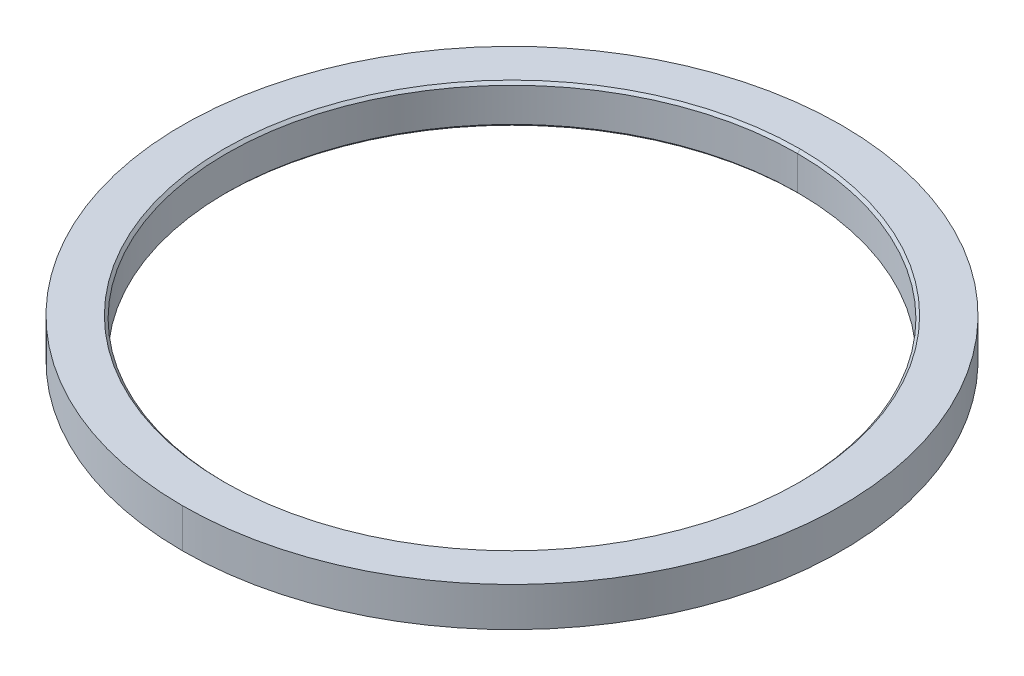
ISO-10303-21;
HEADER;
FILE_DESCRIPTION(('STEP AP214'),'2;1');
FILE_NAME('part.step','',(''),(''),'','','');
FILE_SCHEMA(('AUTOMOTIVE_DESIGN { 1 0 10303 214 1 1 1 1 }'));
ENDSEC;
DATA;
#1=APPLICATION_CONTEXT('core data for automotive mechanical design processes');
#2=APPLICATION_PROTOCOL_DEFINITION('international standard','automotive_design',2000,#1);
#3=PRODUCT_CONTEXT('',#1,'mechanical');
#4=PRODUCT('Part','Part','',(#3));
#5=PRODUCT_RELATED_PRODUCT_CATEGORY('part','',(#4));
#6=PRODUCT_DEFINITION_FORMATION('','',#4);
#7=PRODUCT_DEFINITION_CONTEXT('part definition',#1,'design');
#8=PRODUCT_DEFINITION('design','',#6,#7);
#9=PRODUCT_DEFINITION_SHAPE('','',#8);
#10=(LENGTH_UNIT() NAMED_UNIT(*) SI_UNIT(.MILLI.,.METRE.));
#11=(NAMED_UNIT(*) PLANE_ANGLE_UNIT() SI_UNIT($,.RADIAN.));
#12=(NAMED_UNIT(*) SI_UNIT($,.STERADIAN.) SOLID_ANGLE_UNIT());
#13=UNCERTAINTY_MEASURE_WITH_UNIT(LENGTH_MEASURE(1.E-05),#10,'distance_accuracy_value','');
#14=(GEOMETRIC_REPRESENTATION_CONTEXT(3) GLOBAL_UNCERTAINTY_ASSIGNED_CONTEXT((#13)) GLOBAL_UNIT_ASSIGNED_CONTEXT((#10,
#11,#12)) REPRESENTATION_CONTEXT('',''));
#15=CARTESIAN_POINT('',(0.,0.,0.));
#16=DIRECTION('',(0.,0.,1.));
#17=DIRECTION('',(1.,0.,0.));
#18=AXIS2_PLACEMENT_3D('',#15,#16,#17);
#19=CARTESIAN_POINT('',(0.,4.45,0.));
#20=DIRECTION('',(0.,1.,0.));
#21=DIRECTION('',(0.,0.,1.));
#22=AXIS2_PLACEMENT_3D('',#19,#20,#21);
#23=CONICAL_SURFACE('',#22,32.8,0.78539816339745);
#24=CARTESIAN_POINT('',(0.,4.15,0.));
#25=DIRECTION('',(0.,-1.,0.));
#26=DIRECTION('',(0.,0.,-1.));
#27=AXIS2_PLACEMENT_3D('',#24,#25,#26);
#28=CIRCLE('',#27,32.5);
#29=CARTESIAN_POINT('',(0.,4.15,-32.5));
#30=VERTEX_POINT('',#29);
#31=CARTESIAN_POINT('',(0.,4.15,32.5));
#32=VERTEX_POINT('',#31);
#33=EDGE_CURVE('E98',#30,#32,#28,.T.);
#34=ORIENTED_EDGE('',*,*,#33,.T.);
#35=DIRECTION('',(0.,-0.707106781186545,-0.70710678118655));
#36=VECTOR('',#35,1.);
#37=CARTESIAN_POINT('',(0.,4.15,32.5));
#38=LINE('',#37,#36);
#39=CARTESIAN_POINT('',(0.,4.45,32.8));
#40=VERTEX_POINT('',#39);
#41=EDGE_CURVE('E65',#32,#40,#38,.F.);
#42=ORIENTED_EDGE('',*,*,#41,.T.);
#43=CARTESIAN_POINT('',(0.,4.45,0.));
#44=DIRECTION('',(0.,1.,0.));
#45=DIRECTION('',(0.,0.,1.));
#46=AXIS2_PLACEMENT_3D('',#43,#44,#45);
#47=CIRCLE('',#46,32.8);
#48=CARTESIAN_POINT('',(0.,4.45,-32.8));
#49=VERTEX_POINT('',#48);
#50=EDGE_CURVE('E19',#40,#49,#47,.T.);
#51=ORIENTED_EDGE('',*,*,#50,.T.);
#52=DIRECTION('',(0.,-0.707106781186545,0.70710678118655));
#53=VECTOR('',#52,1.);
#54=CARTESIAN_POINT('',(0.,4.15,-32.5));
#55=LINE('',#54,#53);
#56=EDGE_CURVE('E122',#49,#30,#55,.T.);
#57=ORIENTED_EDGE('',*,*,#56,.T.);
#58=EDGE_LOOP('',(#34,#42,#51,#57));
#59=FACE_BOUND('',#58,.T.);
#60=ADVANCED_FACE('F16',(#59),#23,.F.);
#61=CARTESIAN_POINT('',(0.,4.45,0.));
#62=DIRECTION('',(0.,1.,0.));
#63=DIRECTION('',(0.,0.,1.));
#64=AXIS2_PLACEMENT_3D('',#61,#62,#63);
#65=CONICAL_SURFACE('',#64,32.8,0.78539816339745);
#66=ORIENTED_EDGE('',*,*,#56,.F.);
#67=CARTESIAN_POINT('',(0.,4.45,0.));
#68=DIRECTION('',(0.,1.,0.));
#69=DIRECTION('',(0.,0.,1.));
#70=AXIS2_PLACEMENT_3D('',#67,#68,#69);
#71=CIRCLE('',#70,32.8);
#72=EDGE_CURVE('E88',#49,#40,#71,.T.);
#73=ORIENTED_EDGE('',*,*,#72,.T.);
#74=ORIENTED_EDGE('',*,*,#41,.F.);
#75=CARTESIAN_POINT('',(0.,4.15,0.));
#76=DIRECTION('',(0.,-1.,0.));
#77=DIRECTION('',(0.,0.,-1.));
#78=AXIS2_PLACEMENT_3D('',#75,#76,#77);
#79=CIRCLE('',#78,32.5);
#80=EDGE_CURVE('E93',#32,#30,#79,.T.);
#81=ORIENTED_EDGE('',*,*,#80,.T.);
#82=EDGE_LOOP('',(#66,#73,#74,#81));
#83=FACE_BOUND('',#82,.T.);
#84=ADVANCED_FACE('F143',(#83),#65,.F.);
#85=CARTESIAN_POINT('',(0.,0.,0.));
#86=DIRECTION('',(0.,-1.,0.));
#87=DIRECTION('',(0.,0.,-1.));
#88=AXIS2_PLACEMENT_3D('',#85,#86,#87);
#89=CYLINDRICAL_SURFACE('',#88,32.5);
#90=DIRECTION('',(0.,-1.,0.));
#91=VECTOR('',#90,1.);
#92=CARTESIAN_POINT('',(0.,0.,32.5));
#93=LINE('',#92,#91);
#94=CARTESIAN_POINT('',(0.,0.300000000000001,32.5));
#95=VERTEX_POINT('',#94);
#96=EDGE_CURVE('E91',#32,#95,#93,.T.);
#97=ORIENTED_EDGE('',*,*,#96,.T.);
#98=CARTESIAN_POINT('',(0.,0.300000000000002,0.));
#99=DIRECTION('',(0.,-1.,0.));
#100=DIRECTION('',(0.,0.,-1.));
#101=AXIS2_PLACEMENT_3D('',#98,#99,#100);
#102=CIRCLE('',#101,32.5);
#103=CARTESIAN_POINT('',(0.,0.300000000000001,-32.5));
#104=VERTEX_POINT('',#103);
#105=EDGE_CURVE('E77',#95,#104,#102,.T.);
#106=ORIENTED_EDGE('',*,*,#105,.T.);
#107=DIRECTION('',(0.,-1.,0.));
#108=VECTOR('',#107,1.);
#109=CARTESIAN_POINT('',(0.,0.,-32.5));
#110=LINE('',#109,#108);
#111=EDGE_CURVE('E108',#104,#30,#110,.F.);
#112=ORIENTED_EDGE('',*,*,#111,.T.);
#113=ORIENTED_EDGE('',*,*,#80,.F.);
#114=EDGE_LOOP('',(#97,#106,#112,#113));
#115=FACE_BOUND('',#114,.T.);
#116=ADVANCED_FACE('F92',(#115),#89,.F.);
#117=CARTESIAN_POINT('',(0.,0.,0.));
#118=DIRECTION('',(0.,-1.,0.));
#119=DIRECTION('',(0.,0.,-1.));
#120=AXIS2_PLACEMENT_3D('',#117,#118,#119);
#121=CYLINDRICAL_SURFACE('',#120,32.5);
#122=ORIENTED_EDGE('',*,*,#33,.F.);
#123=ORIENTED_EDGE('',*,*,#111,.F.);
#124=CARTESIAN_POINT('',(0.,0.300000000000002,0.));
#125=DIRECTION('',(0.,-1.,0.));
#126=DIRECTION('',(0.,0.,-1.));
#127=AXIS2_PLACEMENT_3D('',#124,#125,#126);
#128=CIRCLE('',#127,32.5);
#129=EDGE_CURVE('E102',#104,#95,#128,.T.);
#130=ORIENTED_EDGE('',*,*,#129,.T.);
#131=ORIENTED_EDGE('',*,*,#96,.F.);
#132=EDGE_LOOP('',(#122,#123,#130,#131));
#133=FACE_BOUND('',#132,.T.);
#134=ADVANCED_FACE('F107',(#133),#121,.F.);
#135=CARTESIAN_POINT('',(-34.5,4.45,0.));
#136=DIRECTION('',(0.,-1.,0.));
#137=DIRECTION('',(0.,0.,-1.));
#138=AXIS2_PLACEMENT_3D('',#135,#136,#137);
#139=PLANE('',#138);
#140=CARTESIAN_POINT('',(0.,4.45,0.));
#141=DIRECTION('',(0.,1.,0.));
#142=DIRECTION('',(0.,0.,1.));
#143=AXIS2_PLACEMENT_3D('',#140,#141,#142);
#144=CIRCLE('',#143,37.5);
#145=CARTESIAN_POINT('',(0.,4.45,37.5));
#146=VERTEX_POINT('',#145);
#147=CARTESIAN_POINT('',(0.,4.45,-37.5));
#148=VERTEX_POINT('',#147);
#149=EDGE_CURVE('E139',#146,#148,#144,.F.);
#150=ORIENTED_EDGE('',*,*,#149,.F.);
#151=CARTESIAN_POINT('',(0.,4.45,0.));
#152=DIRECTION('',(0.,1.,0.));
#153=DIRECTION('',(0.,0.,1.));
#154=AXIS2_PLACEMENT_3D('',#151,#152,#153);
#155=CIRCLE('',#154,37.5);
#156=EDGE_CURVE('E105',#148,#146,#155,.F.);
#157=ORIENTED_EDGE('',*,*,#156,.F.);
#158=EDGE_LOOP('',(#150,#157));
#159=FACE_BOUND('',#158,.T.);
#160=ORIENTED_EDGE('',*,*,#50,.F.);
#161=ORIENTED_EDGE('',*,*,#72,.F.);
#162=EDGE_LOOP('',(#160,#161));
#163=FACE_BOUND('',#162,.T.);
#164=ADVANCED_FACE('F170',(#159,#163),#139,.F.);
#165=CARTESIAN_POINT('',(0.,0.,0.));
#166=DIRECTION('',(0.,-1.,0.));
#167=DIRECTION('',(0.,0.,-1.));
#168=AXIS2_PLACEMENT_3D('',#165,#166,#167);
#169=CONICAL_SURFACE('',#168,32.8,0.785398163397452);
#170=DIRECTION('',(0.,0.707106781186546,-0.70710678118655));
#171=VECTOR('',#170,1.);
#172=CARTESIAN_POINT('',(0.,0.,32.8));
#173=LINE('',#172,#171);
#174=CARTESIAN_POINT('',(0.,0.,32.8));
#175=VERTEX_POINT('',#174);
#176=EDGE_CURVE('E82',#95,#175,#173,.F.);
#177=ORIENTED_EDGE('',*,*,#176,.T.);
#178=CARTESIAN_POINT('',(0.,0.,0.));
#179=DIRECTION('',(0.,-1.,0.));
#180=DIRECTION('',(0.,0.,-1.));
#181=AXIS2_PLACEMENT_3D('',#178,#179,#180);
#182=CIRCLE('',#181,32.8);
#183=CARTESIAN_POINT('',(0.,0.,-32.8));
#184=VERTEX_POINT('',#183);
#185=EDGE_CURVE('E137',#175,#184,#182,.T.);
#186=ORIENTED_EDGE('',*,*,#185,.T.);
#187=DIRECTION('',(0.,0.707106781186546,0.70710678118655));
#188=VECTOR('',#187,1.);
#189=CARTESIAN_POINT('',(0.,0.,-32.8));
#190=LINE('',#189,#188);
#191=EDGE_CURVE('E84',#184,#104,#190,.T.);
#192=ORIENTED_EDGE('',*,*,#191,.T.);
#193=ORIENTED_EDGE('',*,*,#105,.F.);
#194=EDGE_LOOP('',(#177,#186,#192,#193));
#195=FACE_BOUND('',#194,.T.);
#196=ADVANCED_FACE('F79',(#195),#169,.F.);
#197=CARTESIAN_POINT('',(0.,0.,0.));
#198=DIRECTION('',(0.,-1.,0.));
#199=DIRECTION('',(0.,0.,-1.));
#200=AXIS2_PLACEMENT_3D('',#197,#198,#199);
#201=CONICAL_SURFACE('',#200,32.8,0.785398163397452);
#202=ORIENTED_EDGE('',*,*,#129,.F.);
#203=ORIENTED_EDGE('',*,*,#191,.F.);
#204=CARTESIAN_POINT('',(0.,0.,0.));
#205=DIRECTION('',(0.,-1.,0.));
#206=DIRECTION('',(0.,0.,-1.));
#207=AXIS2_PLACEMENT_3D('',#204,#205,#206);
#208=CIRCLE('',#207,32.8);
#209=EDGE_CURVE('E104',#184,#175,#208,.T.);
#210=ORIENTED_EDGE('',*,*,#209,.T.);
#211=ORIENTED_EDGE('',*,*,#176,.F.);
#212=EDGE_LOOP('',(#202,#203,#210,#211));
#213=FACE_BOUND('',#212,.T.);
#214=ADVANCED_FACE('F101',(#213),#201,.F.);
#215=CARTESIAN_POINT('',(0.,-106.066017177982,0.));
#216=DIRECTION('',(0.,1.,0.));
#217=DIRECTION('',(0.,0.,1.));
#218=AXIS2_PLACEMENT_3D('',#215,#216,#217);
#219=CYLINDRICAL_SURFACE('',#218,37.5);
#220=ORIENTED_EDGE('',*,*,#156,.T.);
#221=DIRECTION('',(0.,1.,0.));
#222=VECTOR('',#221,1.);
#223=CARTESIAN_POINT('',(0.,-106.066017177982,37.5));
#224=LINE('',#223,#222);
#225=CARTESIAN_POINT('',(0.,0.,37.5));
#226=VERTEX_POINT('',#225);
#227=EDGE_CURVE('E141',#226,#146,#224,.T.);
#228=ORIENTED_EDGE('',*,*,#227,.F.);
#229=CARTESIAN_POINT('',(0.,0.,0.));
#230=DIRECTION('',(0.,1.,0.));
#231=DIRECTION('',(0.,0.,1.));
#232=AXIS2_PLACEMENT_3D('',#229,#230,#231);
#233=CIRCLE('',#232,37.5);
#234=CARTESIAN_POINT('',(0.,0.,-37.5));
#235=VERTEX_POINT('',#234);
#236=EDGE_CURVE('E25',#226,#235,#233,.T.);
#237=ORIENTED_EDGE('',*,*,#236,.T.);
#238=DIRECTION('',(0.,1.,0.));
#239=VECTOR('',#238,1.);
#240=CARTESIAN_POINT('',(0.,-106.066017177982,-37.5));
#241=LINE('',#240,#239);
#242=EDGE_CURVE('E33',#148,#235,#241,.F.);
#243=ORIENTED_EDGE('',*,*,#242,.F.);
#244=EDGE_LOOP('',(#220,#228,#237,#243));
#245=FACE_BOUND('',#244,.T.);
#246=ADVANCED_FACE('F159',(#245),#219,.T.);
#247=CARTESIAN_POINT('',(0.,-106.066017177982,0.));
#248=DIRECTION('',(0.,1.,0.));
#249=DIRECTION('',(0.,0.,1.));
#250=AXIS2_PLACEMENT_3D('',#247,#248,#249);
#251=CYLINDRICAL_SURFACE('',#250,37.5);
#252=ORIENTED_EDGE('',*,*,#227,.T.);
#253=ORIENTED_EDGE('',*,*,#149,.T.);
#254=ORIENTED_EDGE('',*,*,#242,.T.);
#255=CARTESIAN_POINT('',(0.,0.,0.));
#256=DIRECTION('',(0.,1.,0.));
#257=DIRECTION('',(0.,0.,1.));
#258=AXIS2_PLACEMENT_3D('',#255,#256,#257);
#259=CIRCLE('',#258,37.5);
#260=EDGE_CURVE('E11',#235,#226,#259,.T.);
#261=ORIENTED_EDGE('',*,*,#260,.T.);
#262=EDGE_LOOP('',(#252,#253,#254,#261));
#263=FACE_BOUND('',#262,.T.);
#264=ADVANCED_FACE('F153',(#263),#251,.T.);
#265=CARTESIAN_POINT('',(-34.5,0.,0.));
#266=DIRECTION('',(0.,1.,0.));
#267=DIRECTION('',(0.,0.,1.));
#268=AXIS2_PLACEMENT_3D('',#265,#266,#267);
#269=PLANE('',#268);
#270=ORIENTED_EDGE('',*,*,#236,.F.);
#271=ORIENTED_EDGE('',*,*,#260,.F.);
#272=EDGE_LOOP('',(#270,#271));
#273=FACE_BOUND('',#272,.T.);
#274=ORIENTED_EDGE('',*,*,#185,.F.);
#275=ORIENTED_EDGE('',*,*,#209,.F.);
#276=EDGE_LOOP('',(#274,#275));
#277=FACE_BOUND('',#276,.T.);
#278=ADVANCED_FACE('F151',(#273,#277),#269,.F.);
#279=CLOSED_SHELL('',(#60,#84,#116,#134,#164,#196,#214,#246,#264,#278));
#280=MANIFOLD_SOLID_BREP('B1',#279);
#281=ADVANCED_BREP_SHAPE_REPRESENTATION('',(#18,#280),#14);
#282=SHAPE_DEFINITION_REPRESENTATION(#9,#281);
ENDSEC;
END-ISO-10303-21;
